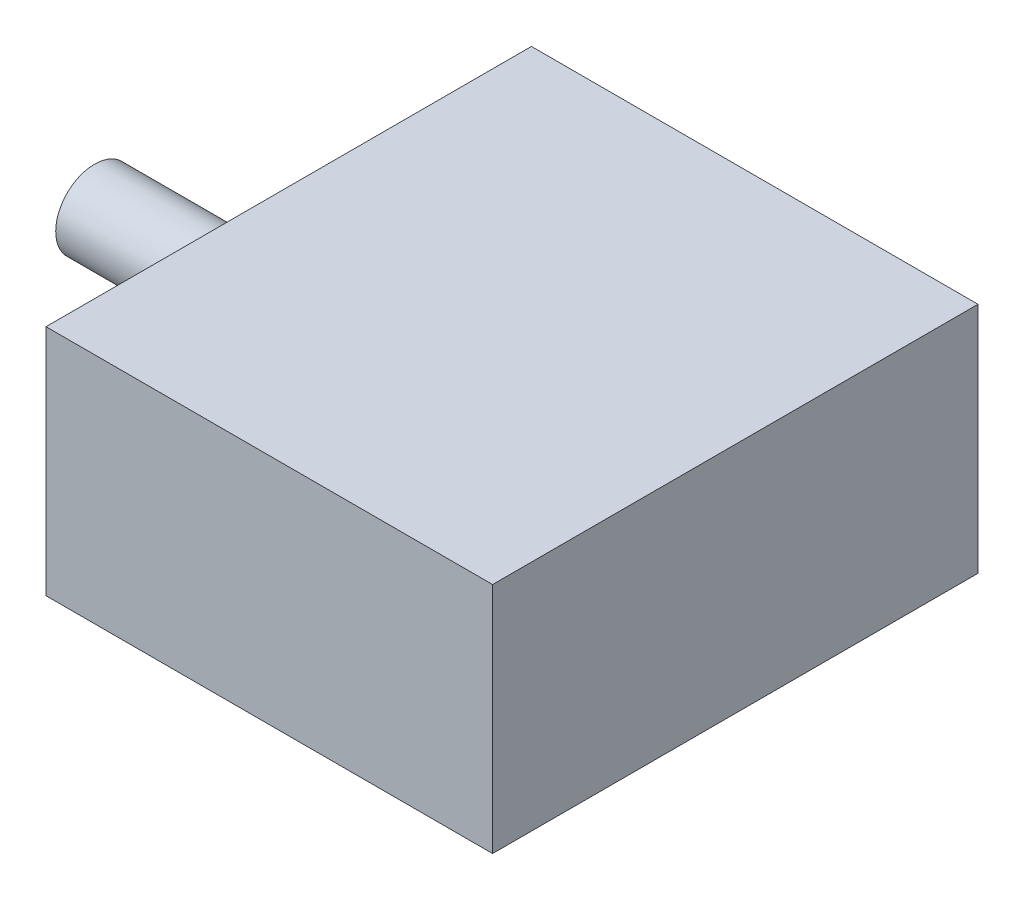
ISO-10303-21;
HEADER;
FILE_DESCRIPTION(('STEP AP214'),'2;1');
FILE_NAME('part.step','',(''),(''),'','','');
FILE_SCHEMA(('AUTOMOTIVE_DESIGN { 1 0 10303 214 1 1 1 1 }'));
ENDSEC;
DATA;
#1=APPLICATION_CONTEXT('core data for automotive mechanical design processes');
#2=APPLICATION_PROTOCOL_DEFINITION('international standard','automotive_design',2000,#1);
#3=PRODUCT_CONTEXT('',#1,'mechanical');
#4=PRODUCT('Part','Part','',(#3));
#5=PRODUCT_RELATED_PRODUCT_CATEGORY('part','',(#4));
#6=PRODUCT_DEFINITION_FORMATION('','',#4);
#7=PRODUCT_DEFINITION_CONTEXT('part definition',#1,'design');
#8=PRODUCT_DEFINITION('design','',#6,#7);
#9=PRODUCT_DEFINITION_SHAPE('','',#8);
#10=(LENGTH_UNIT() NAMED_UNIT(*) SI_UNIT(.MILLI.,.METRE.));
#11=(NAMED_UNIT(*) PLANE_ANGLE_UNIT() SI_UNIT($,.RADIAN.));
#12=(NAMED_UNIT(*) SI_UNIT($,.STERADIAN.) SOLID_ANGLE_UNIT());
#13=UNCERTAINTY_MEASURE_WITH_UNIT(LENGTH_MEASURE(1.E-05),#10,'distance_accuracy_value','');
#14=(GEOMETRIC_REPRESENTATION_CONTEXT(3) GLOBAL_UNCERTAINTY_ASSIGNED_CONTEXT((#13)) GLOBAL_UNIT_ASSIGNED_CONTEXT((#10,
#11,#12)) REPRESENTATION_CONTEXT('',''));
#15=CARTESIAN_POINT('',(0.,0.,0.));
#16=DIRECTION('',(0.,0.,1.));
#17=DIRECTION('',(1.,0.,0.));
#18=AXIS2_PLACEMENT_3D('',#15,#16,#17);
#19=CARTESIAN_POINT('',(0.,0.,25.));
#20=DIRECTION('',(1.,0.,0.));
#21=DIRECTION('',(0.,0.,-1.));
#22=AXIS2_PLACEMENT_3D('',#19,#20,#21);
#23=PLANE('',#22);
#24=CARTESIAN_POINT('',(0.,6.,12.5));
#25=DIRECTION('',(1.,0.,0.));
#26=DIRECTION('',(0.,0.,-1.));
#27=AXIS2_PLACEMENT_3D('',#24,#25,#26);
#28=CIRCLE('',#27,2.);
#29=CARTESIAN_POINT('',(0.,6.,10.5));
#30=VERTEX_POINT('',#29);
#31=EDGE_CURVE('E11',#30,#30,#28,.F.);
#32=ORIENTED_EDGE('',*,*,#31,.F.);
#33=EDGE_LOOP('',(#32));
#34=FACE_BOUND('',#33,.T.);
#35=DIRECTION('',(0.,-1.,0.));
#36=VECTOR('',#35,1.);
#37=CARTESIAN_POINT('',(0.,0.,0.));
#38=LINE('',#37,#36);
#39=CARTESIAN_POINT('',(0.,12.,0.));
#40=VERTEX_POINT('',#39);
#41=CARTESIAN_POINT('',(0.,0.,0.));
#42=VERTEX_POINT('',#41);
#43=EDGE_CURVE('E99',#40,#42,#38,.T.);
#44=ORIENTED_EDGE('',*,*,#43,.T.);
#45=DIRECTION('',(0.,0.,-1.));
#46=VECTOR('',#45,1.);
#47=CARTESIAN_POINT('',(0.,0.,25.));
#48=LINE('',#47,#46);
#49=CARTESIAN_POINT('',(0.,0.,25.));
#50=VERTEX_POINT('',#49);
#51=EDGE_CURVE('E41',#50,#42,#48,.T.);
#52=ORIENTED_EDGE('',*,*,#51,.F.);
#53=DIRECTION('',(0.,-1.,0.));
#54=VECTOR('',#53,1.);
#55=CARTESIAN_POINT('',(0.,0.,25.));
#56=LINE('',#55,#54);
#57=CARTESIAN_POINT('',(0.,12.,25.));
#58=VERTEX_POINT('',#57);
#59=EDGE_CURVE('E85',#58,#50,#56,.T.);
#60=ORIENTED_EDGE('',*,*,#59,.F.);
#61=DIRECTION('',(0.,0.,-1.));
#62=VECTOR('',#61,1.);
#63=CARTESIAN_POINT('',(0.,12.,25.));
#64=LINE('',#63,#62);
#65=EDGE_CURVE('E95',#58,#40,#64,.T.);
#66=ORIENTED_EDGE('',*,*,#65,.T.);
#67=EDGE_LOOP('',(#44,#52,#60,#66));
#68=FACE_BOUND('',#67,.T.);
#69=ADVANCED_FACE('F33',(#34,#68),#23,.F.);
#70=CARTESIAN_POINT('',(0.,0.,25.));
#71=DIRECTION('',(0.,1.,0.));
#72=DIRECTION('',(0.,0.,1.));
#73=AXIS2_PLACEMENT_3D('',#70,#71,#72);
#74=PLANE('',#73);
#75=DIRECTION('',(1.,0.,0.));
#76=VECTOR('',#75,1.);
#77=CARTESIAN_POINT('',(0.,0.,0.));
#78=LINE('',#77,#76);
#79=CARTESIAN_POINT('',(23.,0.,0.));
#80=VERTEX_POINT('',#79);
#81=EDGE_CURVE('E90',#42,#80,#78,.T.);
#82=ORIENTED_EDGE('',*,*,#81,.T.);
#83=DIRECTION('',(0.,0.,-1.));
#84=VECTOR('',#83,1.);
#85=CARTESIAN_POINT('',(23.,0.,25.));
#86=LINE('',#85,#84);
#87=CARTESIAN_POINT('',(23.,0.,25.));
#88=VERTEX_POINT('',#87);
#89=EDGE_CURVE('E88',#88,#80,#86,.T.);
#90=ORIENTED_EDGE('',*,*,#89,.F.);
#91=DIRECTION('',(1.,0.,0.));
#92=VECTOR('',#91,1.);
#93=CARTESIAN_POINT('',(0.,0.,25.));
#94=LINE('',#93,#92);
#95=EDGE_CURVE('E80',#50,#88,#94,.T.);
#96=ORIENTED_EDGE('',*,*,#95,.F.);
#97=ORIENTED_EDGE('',*,*,#51,.T.);
#98=EDGE_LOOP('',(#82,#90,#96,#97));
#99=FACE_BOUND('',#98,.T.);
#100=ADVANCED_FACE('F89',(#99),#74,.F.);
#101=CARTESIAN_POINT('',(23.,0.,25.));
#102=DIRECTION('',(-1.,0.,0.));
#103=DIRECTION('',(0.,0.,1.));
#104=AXIS2_PLACEMENT_3D('',#101,#102,#103);
#105=PLANE('',#104);
#106=DIRECTION('',(0.,1.,0.));
#107=VECTOR('',#106,1.);
#108=CARTESIAN_POINT('',(23.,0.,0.));
#109=LINE('',#108,#107);
#110=CARTESIAN_POINT('',(23.,12.,0.));
#111=VERTEX_POINT('',#110);
#112=EDGE_CURVE('E66',#80,#111,#109,.T.);
#113=ORIENTED_EDGE('',*,*,#112,.T.);
#114=DIRECTION('',(0.,0.,-1.));
#115=VECTOR('',#114,1.);
#116=CARTESIAN_POINT('',(23.,12.,25.));
#117=LINE('',#116,#115);
#118=CARTESIAN_POINT('',(23.,12.,25.));
#119=VERTEX_POINT('',#118);
#120=EDGE_CURVE('E91',#119,#111,#117,.T.);
#121=ORIENTED_EDGE('',*,*,#120,.F.);
#122=DIRECTION('',(0.,1.,0.));
#123=VECTOR('',#122,1.);
#124=CARTESIAN_POINT('',(23.,0.,25.));
#125=LINE('',#124,#123);
#126=EDGE_CURVE('E83',#88,#119,#125,.T.);
#127=ORIENTED_EDGE('',*,*,#126,.F.);
#128=ORIENTED_EDGE('',*,*,#89,.T.);
#129=EDGE_LOOP('',(#113,#121,#127,#128));
#130=FACE_BOUND('',#129,.T.);
#131=ADVANCED_FACE('F93',(#130),#105,.F.);
#132=CARTESIAN_POINT('',(0.,12.,25.));
#133=DIRECTION('',(0.,-1.,0.));
#134=DIRECTION('',(0.,0.,-1.));
#135=AXIS2_PLACEMENT_3D('',#132,#133,#134);
#136=PLANE('',#135);
#137=DIRECTION('',(-1.,0.,0.));
#138=VECTOR('',#137,1.);
#139=CARTESIAN_POINT('',(0.,12.,0.));
#140=LINE('',#139,#138);
#141=EDGE_CURVE('E72',#111,#40,#140,.T.);
#142=ORIENTED_EDGE('',*,*,#141,.T.);
#143=ORIENTED_EDGE('',*,*,#65,.F.);
#144=DIRECTION('',(-1.,0.,0.));
#145=VECTOR('',#144,1.);
#146=CARTESIAN_POINT('',(0.,12.,25.));
#147=LINE('',#146,#145);
#148=EDGE_CURVE('E49',#119,#58,#147,.T.);
#149=ORIENTED_EDGE('',*,*,#148,.F.);
#150=ORIENTED_EDGE('',*,*,#120,.T.);
#151=EDGE_LOOP('',(#142,#143,#149,#150));
#152=FACE_BOUND('',#151,.T.);
#153=ADVANCED_FACE('F121',(#152),#136,.F.);
#154=CARTESIAN_POINT('',(0.,0.,25.));
#155=DIRECTION('',(0.,0.,-1.));
#156=DIRECTION('',(-1.,0.,0.));
#157=AXIS2_PLACEMENT_3D('',#154,#155,#156);
#158=PLANE('',#157);
#159=ORIENTED_EDGE('',*,*,#59,.T.);
#160=ORIENTED_EDGE('',*,*,#95,.T.);
#161=ORIENTED_EDGE('',*,*,#126,.T.);
#162=ORIENTED_EDGE('',*,*,#148,.T.);
#163=EDGE_LOOP('',(#159,#160,#161,#162));
#164=FACE_BOUND('',#163,.T.);
#165=ADVANCED_FACE('F81',(#164),#158,.F.);
#166=CARTESIAN_POINT('',(0.,0.,0.));
#167=DIRECTION('',(0.,0.,-1.));
#168=DIRECTION('',(-1.,0.,0.));
#169=AXIS2_PLACEMENT_3D('',#166,#167,#168);
#170=PLANE('',#169);
#171=ORIENTED_EDGE('',*,*,#43,.F.);
#172=ORIENTED_EDGE('',*,*,#141,.F.);
#173=ORIENTED_EDGE('',*,*,#112,.F.);
#174=ORIENTED_EDGE('',*,*,#81,.F.);
#175=EDGE_LOOP('',(#171,#172,#173,#174));
#176=FACE_BOUND('',#175,.T.);
#177=ADVANCED_FACE('F110',(#176),#170,.T.);
#178=CARTESIAN_POINT('',(-10.,6.,12.5));
#179=DIRECTION('',(1.,0.,0.));
#180=DIRECTION('',(0.,0.,-1.));
#181=AXIS2_PLACEMENT_3D('',#178,#179,#180);
#182=CYLINDRICAL_SURFACE('',#181,2.);
#183=CARTESIAN_POINT('',(-10.,6.,12.5));
#184=DIRECTION('',(-1.,0.,0.));
#185=DIRECTION('',(0.,0.,1.));
#186=AXIS2_PLACEMENT_3D('',#183,#184,#185);
#187=CIRCLE('',#186,2.);
#188=CARTESIAN_POINT('',(-10.,6.,14.5));
#189=VERTEX_POINT('',#188);
#190=EDGE_CURVE('E102',#189,#189,#187,.T.);
#191=ORIENTED_EDGE('',*,*,#190,.F.);
#192=EDGE_LOOP('',(#191));
#193=FACE_BOUND('',#192,.T.);
#194=ORIENTED_EDGE('',*,*,#31,.T.);
#195=EDGE_LOOP('',(#194));
#196=FACE_BOUND('',#195,.T.);
#197=ADVANCED_FACE('F112',(#193,#196),#182,.T.);
#198=CARTESIAN_POINT('',(-10.,6.,12.5));
#199=DIRECTION('',(-1.,0.,0.));
#200=DIRECTION('',(0.,0.,1.));
#201=AXIS2_PLACEMENT_3D('',#198,#199,#200);
#202=PLANE('',#201);
#203=ORIENTED_EDGE('',*,*,#190,.T.);
#204=EDGE_LOOP('',(#203));
#205=FACE_BOUND('',#204,.T.);
#206=ADVANCED_FACE('F118',(#205),#202,.T.);
#207=CLOSED_SHELL('',(#69,#100,#131,#153,#165,#177,#197,#206));
#208=MANIFOLD_SOLID_BREP('B2',#207);
#209=ADVANCED_BREP_SHAPE_REPRESENTATION('',(#18,#208),#14);
#210=SHAPE_DEFINITION_REPRESENTATION(#9,#209);
ENDSEC;
END-ISO-10303-21;
